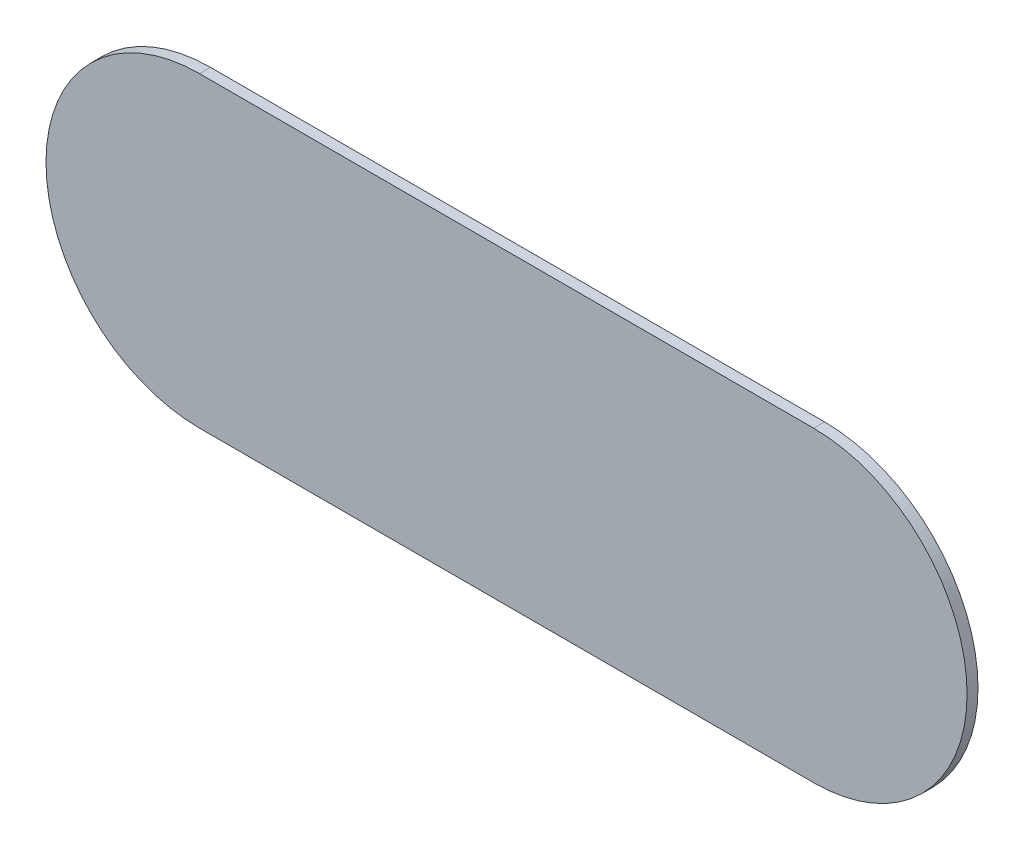
ISO-10303-21;
HEADER;
FILE_DESCRIPTION(('STEP AP214'),'2;1');
FILE_NAME('part.step','',(''),(''),'','','');
FILE_SCHEMA(('AUTOMOTIVE_DESIGN { 1 0 10303 214 1 1 1 1 }'));
ENDSEC;
DATA;
#1=APPLICATION_CONTEXT('core data for automotive mechanical design processes');
#2=APPLICATION_PROTOCOL_DEFINITION('international standard','automotive_design',2000,#1);
#3=PRODUCT_CONTEXT('',#1,'mechanical');
#4=PRODUCT('Part','Part','',(#3));
#5=PRODUCT_RELATED_PRODUCT_CATEGORY('part','',(#4));
#6=PRODUCT_DEFINITION_FORMATION('','',#4);
#7=PRODUCT_DEFINITION_CONTEXT('part definition',#1,'design');
#8=PRODUCT_DEFINITION('design','',#6,#7);
#9=PRODUCT_DEFINITION_SHAPE('','',#8);
#10=(LENGTH_UNIT() NAMED_UNIT(*) SI_UNIT(.MILLI.,.METRE.));
#11=(NAMED_UNIT(*) PLANE_ANGLE_UNIT() SI_UNIT($,.RADIAN.));
#12=(NAMED_UNIT(*) SI_UNIT($,.STERADIAN.) SOLID_ANGLE_UNIT());
#13=UNCERTAINTY_MEASURE_WITH_UNIT(LENGTH_MEASURE(1.E-05),#10,'distance_accuracy_value','');
#14=(GEOMETRIC_REPRESENTATION_CONTEXT(3) GLOBAL_UNCERTAINTY_ASSIGNED_CONTEXT((#13)) GLOBAL_UNIT_ASSIGNED_CONTEXT((#10,
#11,#12)) REPRESENTATION_CONTEXT('',''));
#15=CARTESIAN_POINT('',(0.,0.,0.));
#16=DIRECTION('',(0.,0.,1.));
#17=DIRECTION('',(1.,0.,0.));
#18=AXIS2_PLACEMENT_3D('',#15,#16,#17);
#19=CARTESIAN_POINT('',(42.0058342,70.39418992,0.));
#20=DIRECTION('',(0.,1.,0.));
#21=DIRECTION('',(1.,0.,0.));
#22=AXIS2_PLACEMENT_3D('',#19,#20,#21);
#23=PLANE('',#22);
#24=DIRECTION('',(1.,0.,0.));
#25=VECTOR('',#24,1.);
#26=CARTESIAN_POINT('',(42.0058342,70.39418992,0.03556));
#27=LINE('',#26,#25);
#28=CARTESIAN_POINT('',(42.0058342,70.39418992,0.03556));
#29=VERTEX_POINT('',#28);
#30=CARTESIAN_POINT('',(44.00580988,70.39418992,0.03556));
#31=VERTEX_POINT('',#30);
#32=EDGE_CURVE('E11',#29,#31,#27,.T.);
#33=ORIENTED_EDGE('',*,*,#32,.F.);
#34=DIRECTION('',(0.,0.,1.));
#35=VECTOR('',#34,1.);
#36=CARTESIAN_POINT('',(42.0058342,70.39418992,0.));
#37=LINE('',#36,#35);
#38=CARTESIAN_POINT('',(42.0058342,70.39418992,0.));
#39=VERTEX_POINT('',#38);
#40=EDGE_CURVE('E24',#39,#29,#37,.T.);
#41=ORIENTED_EDGE('',*,*,#40,.F.);
#42=DIRECTION('',(1.,0.,0.));
#43=VECTOR('',#42,1.);
#44=CARTESIAN_POINT('',(42.0058342,70.39418992,0.));
#45=LINE('',#44,#43);
#46=CARTESIAN_POINT('',(44.00580988,70.39418992,0.));
#47=VERTEX_POINT('',#46);
#48=EDGE_CURVE('E75',#39,#47,#45,.T.);
#49=ORIENTED_EDGE('',*,*,#48,.T.);
#50=DIRECTION('',(0.,0.,1.));
#51=VECTOR('',#50,1.);
#52=CARTESIAN_POINT('',(44.00580988,70.39418992,0.));
#53=LINE('',#52,#51);
#54=EDGE_CURVE('E37',#47,#31,#53,.T.);
#55=ORIENTED_EDGE('',*,*,#54,.T.);
#56=EDGE_LOOP('',(#33,#41,#49,#55));
#57=FACE_BOUND('',#56,.T.);
#58=ADVANCED_FACE('F17',(#57),#23,.F.);
#59=CARTESIAN_POINT('',(44.00580988,70.89418892,0.));
#60=DIRECTION('',(0.,0.,-1.));
#61=DIRECTION('',(0.,-1.,0.));
#62=AXIS2_PLACEMENT_3D('',#59,#60,#61);
#63=CYLINDRICAL_SURFACE('',#62,0.499998999999993);
#64=CARTESIAN_POINT('',(44.00580988,70.89418892,0.03556));
#65=DIRECTION('',(0.,0.,1.));
#66=DIRECTION('',(0.,-1.,0.));
#67=AXIS2_PLACEMENT_3D('',#64,#65,#66);
#68=CIRCLE('',#67,0.499998999999993);
#69=CARTESIAN_POINT('',(44.00580988,71.39418792,0.03556));
#70=VERTEX_POINT('',#69);
#71=EDGE_CURVE('E83',#31,#70,#68,.T.);
#72=ORIENTED_EDGE('',*,*,#71,.F.);
#73=ORIENTED_EDGE('',*,*,#54,.F.);
#74=CARTESIAN_POINT('',(44.00580988,70.89418892,0.));
#75=DIRECTION('',(0.,0.,1.));
#76=DIRECTION('',(0.,-1.,0.));
#77=AXIS2_PLACEMENT_3D('',#74,#75,#76);
#78=CIRCLE('',#77,0.499998999999993);
#79=CARTESIAN_POINT('',(44.00580988,71.39418792,0.));
#80=VERTEX_POINT('',#79);
#81=EDGE_CURVE('E81',#47,#80,#78,.T.);
#82=ORIENTED_EDGE('',*,*,#81,.T.);
#83=DIRECTION('',(0.,0.,1.));
#84=VECTOR('',#83,1.);
#85=CARTESIAN_POINT('',(44.00580988,71.39418792,0.));
#86=LINE('',#85,#84);
#87=EDGE_CURVE('E67',#80,#70,#86,.T.);
#88=ORIENTED_EDGE('',*,*,#87,.T.);
#89=EDGE_LOOP('',(#72,#73,#82,#88));
#90=FACE_BOUND('',#89,.T.);
#91=ADVANCED_FACE('F89',(#90),#63,.T.);
#92=CARTESIAN_POINT('',(44.00580988,71.39418792,0.));
#93=DIRECTION('',(0.,-1.,0.));
#94=DIRECTION('',(-1.,0.,0.));
#95=AXIS2_PLACEMENT_3D('',#92,#93,#94);
#96=PLANE('',#95);
#97=DIRECTION('',(-1.,0.,0.));
#98=VECTOR('',#97,1.);
#99=CARTESIAN_POINT('',(44.00580988,71.39418792,0.03556));
#100=LINE('',#99,#98);
#101=CARTESIAN_POINT('',(42.0058342,71.39418792,0.03556));
#102=VERTEX_POINT('',#101);
#103=EDGE_CURVE('E71',#70,#102,#100,.T.);
#104=ORIENTED_EDGE('',*,*,#103,.F.);
#105=ORIENTED_EDGE('',*,*,#87,.F.);
#106=DIRECTION('',(-1.,0.,0.));
#107=VECTOR('',#106,1.);
#108=CARTESIAN_POINT('',(44.00580988,71.39418792,0.));
#109=LINE('',#108,#107);
#110=CARTESIAN_POINT('',(42.0058342,71.39418792,0.));
#111=VERTEX_POINT('',#110);
#112=EDGE_CURVE('E63',#80,#111,#109,.T.);
#113=ORIENTED_EDGE('',*,*,#112,.T.);
#114=DIRECTION('',(0.,0.,1.));
#115=VECTOR('',#114,1.);
#116=CARTESIAN_POINT('',(42.0058342,71.39418792,0.));
#117=LINE('',#116,#115);
#118=EDGE_CURVE('E53',#111,#102,#117,.T.);
#119=ORIENTED_EDGE('',*,*,#118,.T.);
#120=EDGE_LOOP('',(#104,#105,#113,#119));
#121=FACE_BOUND('',#120,.T.);
#122=ADVANCED_FACE('F66',(#121),#96,.F.);
#123=CARTESIAN_POINT('',(42.0058342,70.89418892,0.));
#124=DIRECTION('',(0.,0.,-1.));
#125=DIRECTION('',(0.,1.,0.));
#126=AXIS2_PLACEMENT_3D('',#123,#124,#125);
#127=CYLINDRICAL_SURFACE('',#126,0.499998999999993);
#128=CARTESIAN_POINT('',(42.0058342,70.89418892,0.03556));
#129=DIRECTION('',(0.,0.,1.));
#130=DIRECTION('',(0.,1.,0.));
#131=AXIS2_PLACEMENT_3D('',#128,#129,#130);
#132=CIRCLE('',#131,0.499998999999993);
#133=EDGE_CURVE('E59',#102,#29,#132,.T.);
#134=ORIENTED_EDGE('',*,*,#133,.F.);
#135=ORIENTED_EDGE('',*,*,#118,.F.);
#136=CARTESIAN_POINT('',(42.0058342,70.89418892,0.));
#137=DIRECTION('',(0.,0.,1.));
#138=DIRECTION('',(0.,1.,0.));
#139=AXIS2_PLACEMENT_3D('',#136,#137,#138);
#140=CIRCLE('',#139,0.499998999999993);
#141=EDGE_CURVE('E57',#111,#39,#140,.T.);
#142=ORIENTED_EDGE('',*,*,#141,.T.);
#143=ORIENTED_EDGE('',*,*,#40,.T.);
#144=EDGE_LOOP('',(#134,#135,#142,#143));
#145=FACE_BOUND('',#144,.T.);
#146=ADVANCED_FACE('F55',(#145),#127,.T.);
#147=CARTESIAN_POINT('',(42.0058342,70.39418992,0.));
#148=DIRECTION('',(0.,0.,-1.));
#149=DIRECTION('',(-1.,0.,0.));
#150=AXIS2_PLACEMENT_3D('',#147,#148,#149);
#151=PLANE('',#150);
#152=ORIENTED_EDGE('',*,*,#141,.F.);
#153=ORIENTED_EDGE('',*,*,#112,.F.);
#154=ORIENTED_EDGE('',*,*,#81,.F.);
#155=ORIENTED_EDGE('',*,*,#48,.F.);
#156=EDGE_LOOP('',(#152,#153,#154,#155));
#157=FACE_BOUND('',#156,.T.);
#158=ADVANCED_FACE('F74',(#157),#151,.T.);
#159=CARTESIAN_POINT('',(42.0058342,70.39418992,0.03556));
#160=DIRECTION('',(0.,0.,-1.));
#161=DIRECTION('',(-1.,0.,0.));
#162=AXIS2_PLACEMENT_3D('',#159,#160,#161);
#163=PLANE('',#162);
#164=ORIENTED_EDGE('',*,*,#32,.T.);
#165=ORIENTED_EDGE('',*,*,#71,.T.);
#166=ORIENTED_EDGE('',*,*,#103,.T.);
#167=ORIENTED_EDGE('',*,*,#133,.T.);
#168=EDGE_LOOP('',(#164,#165,#166,#167));
#169=FACE_BOUND('',#168,.T.);
#170=ADVANCED_FACE('F91',(#169),#163,.F.);
#171=CLOSED_SHELL('',(#58,#91,#122,#146,#158,#170));
#172=MANIFOLD_SOLID_BREP('B1',#171);
#173=ADVANCED_BREP_SHAPE_REPRESENTATION('',(#18,#172),#14);
#174=SHAPE_DEFINITION_REPRESENTATION(#9,#173);
ENDSEC;
END-ISO-10303-21;
